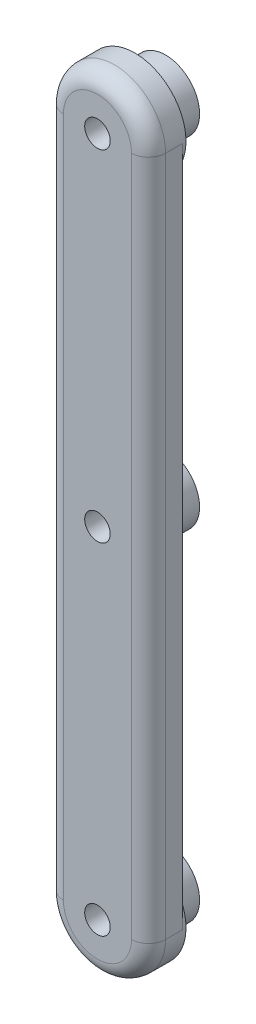
ISO-10303-21;
HEADER;
FILE_DESCRIPTION(('STEP AP214'),'2;1');
FILE_NAME('part.step','',(''),(''),'','','');
FILE_SCHEMA(('AUTOMOTIVE_DESIGN { 1 0 10303 214 1 1 1 1 }'));
ENDSEC;
DATA;
#1=APPLICATION_CONTEXT('core data for automotive mechanical design processes');
#2=APPLICATION_PROTOCOL_DEFINITION('international standard','automotive_design',2000,#1);
#3=PRODUCT_CONTEXT('',#1,'mechanical');
#4=PRODUCT('Part','Part','',(#3));
#5=PRODUCT_RELATED_PRODUCT_CATEGORY('part','',(#4));
#6=PRODUCT_DEFINITION_FORMATION('','',#4);
#7=PRODUCT_DEFINITION_CONTEXT('part definition',#1,'design');
#8=PRODUCT_DEFINITION('design','',#6,#7);
#9=PRODUCT_DEFINITION_SHAPE('','',#8);
#10=(LENGTH_UNIT() NAMED_UNIT(*) SI_UNIT(.MILLI.,.METRE.));
#11=(NAMED_UNIT(*) PLANE_ANGLE_UNIT() SI_UNIT($,.RADIAN.));
#12=(NAMED_UNIT(*) SI_UNIT($,.STERADIAN.) SOLID_ANGLE_UNIT());
#13=UNCERTAINTY_MEASURE_WITH_UNIT(LENGTH_MEASURE(1.E-05),#10,'distance_accuracy_value','');
#14=(GEOMETRIC_REPRESENTATION_CONTEXT(3) GLOBAL_UNCERTAINTY_ASSIGNED_CONTEXT((#13)) GLOBAL_UNIT_ASSIGNED_CONTEXT((#10,
#11,#12)) REPRESENTATION_CONTEXT('',''));
#15=CARTESIAN_POINT('',(0.,0.,0.));
#16=DIRECTION('',(0.,0.,1.));
#17=DIRECTION('',(1.,0.,0.));
#18=AXIS2_PLACEMENT_3D('',#15,#16,#17);
#19=CARTESIAN_POINT('',(0.,40.,2.));
#20=DIRECTION('',(0.,0.,-1.));
#21=DIRECTION('',(-1.,0.,0.));
#22=AXIS2_PLACEMENT_3D('',#19,#20,#21);
#23=CYLINDRICAL_SURFACE('',#22,6.00000000000001);
#24=DIRECTION('',(0.,0.,-1.));
#25=VECTOR('',#24,1.);
#26=CARTESIAN_POINT('',(-6.00000000000001,40.,2.));
#27=LINE('',#26,#25);
#28=CARTESIAN_POINT('',(-6.00000000000001,40.,0.));
#29=VERTEX_POINT('',#28);
#30=CARTESIAN_POINT('',(-6.00000000000001,40.,-2.));
#31=VERTEX_POINT('',#30);
#32=EDGE_CURVE('E128',#29,#31,#27,.T.);
#33=ORIENTED_EDGE('',*,*,#32,.F.);
#34=CARTESIAN_POINT('',(0.,40.,0.));
#35=DIRECTION('',(0.,0.,1.));
#36=DIRECTION('',(1.,0.,0.));
#37=AXIS2_PLACEMENT_3D('',#34,#35,#36);
#38=CIRCLE('',#37,6.00000000000001);
#39=CARTESIAN_POINT('',(6.00000000000002,40.,0.));
#40=VERTEX_POINT('',#39);
#41=EDGE_CURVE('E11',#29,#40,#38,.F.);
#42=ORIENTED_EDGE('',*,*,#41,.T.);
#43=DIRECTION('',(0.,0.,-1.));
#44=VECTOR('',#43,1.);
#45=CARTESIAN_POINT('',(6.00000000000002,40.,2.));
#46=LINE('',#45,#44);
#47=CARTESIAN_POINT('',(6.00000000000003,40.,-2.));
#48=VERTEX_POINT('',#47);
#49=EDGE_CURVE('E95',#40,#48,#46,.T.);
#50=ORIENTED_EDGE('',*,*,#49,.T.);
#51=CARTESIAN_POINT('',(0.,40.,-2.));
#52=DIRECTION('',(0.,0.,-1.));
#53=DIRECTION('',(-1.,0.,0.));
#54=AXIS2_PLACEMENT_3D('',#51,#52,#53);
#55=CIRCLE('',#54,6.00000000000001);
#56=EDGE_CURVE('E98',#48,#31,#55,.T.);
#57=ORIENTED_EDGE('',*,*,#56,.T.);
#58=EDGE_LOOP('',(#33,#42,#50,#57));
#59=FACE_BOUND('',#58,.T.);
#60=CARTESIAN_POINT('',(0.,40.,-2.4));
#61=DIRECTION('',(0.,0.,-1.));
#62=DIRECTION('',(-1.,0.,0.));
#63=AXIS2_PLACEMENT_3D('',#60,#61,#62);
#64=CIRCLE('',#63,6.00000000000001);
#65=CARTESIAN_POINT('',(-5.99999999999999,40.,-2.4));
#66=VERTEX_POINT('',#65);
#67=EDGE_CURVE('E180',#66,#66,#64,.T.);
#68=ORIENTED_EDGE('',*,*,#67,.F.);
#69=EDGE_LOOP('',(#68));
#70=FACE_BOUND('',#69,.T.);
#71=ADVANCED_FACE('F41',(#59,#70),#23,.T.);
#72=CARTESIAN_POINT('',(-6.00000000000001,40.,2.));
#73=DIRECTION('',(1.,0.,0.));
#74=DIRECTION('',(0.,1.,0.));
#75=AXIS2_PLACEMENT_3D('',#72,#73,#74);
#76=PLANE('',#75);
#77=DIRECTION('',(0.,0.,-1.));
#78=VECTOR('',#77,1.);
#79=CARTESIAN_POINT('',(-5.99999999999999,-40.,2.));
#80=LINE('',#79,#78);
#81=CARTESIAN_POINT('',(-5.99999999999999,-40.,0.));
#82=VERTEX_POINT('',#81);
#83=CARTESIAN_POINT('',(-5.99999999999999,-40.,-2.));
#84=VERTEX_POINT('',#83);
#85=EDGE_CURVE('E126',#82,#84,#80,.T.);
#86=ORIENTED_EDGE('',*,*,#85,.F.);
#87=DIRECTION('',(0.,-1.,0.));
#88=VECTOR('',#87,1.);
#89=CARTESIAN_POINT('',(-6.00000000000001,40.,0.));
#90=LINE('',#89,#88);
#91=EDGE_CURVE('E50',#82,#29,#90,.F.);
#92=ORIENTED_EDGE('',*,*,#91,.T.);
#93=ORIENTED_EDGE('',*,*,#32,.T.);
#94=DIRECTION('',(0.,-1.,0.));
#95=VECTOR('',#94,1.);
#96=CARTESIAN_POINT('',(-6.00000000000001,40.,-2.));
#97=LINE('',#96,#95);
#98=EDGE_CURVE('E115',#31,#84,#97,.T.);
#99=ORIENTED_EDGE('',*,*,#98,.T.);
#100=EDGE_LOOP('',(#86,#92,#93,#99));
#101=FACE_BOUND('',#100,.T.);
#102=ADVANCED_FACE('F202',(#101),#76,.F.);
#103=CARTESIAN_POINT('',(0.,-40.,2.));
#104=DIRECTION('',(0.,0.,-1.));
#105=DIRECTION('',(-1.,0.,0.));
#106=AXIS2_PLACEMENT_3D('',#103,#104,#105);
#107=CYLINDRICAL_SURFACE('',#106,6.00000000000001);
#108=DIRECTION('',(0.,0.,-1.));
#109=VECTOR('',#108,1.);
#110=CARTESIAN_POINT('',(6.00000000000002,-40.,2.));
#111=LINE('',#110,#109);
#112=CARTESIAN_POINT('',(6.00000000000002,-40.,0.));
#113=VERTEX_POINT('',#112);
#114=CARTESIAN_POINT('',(6.00000000000003,-40.,-2.));
#115=VERTEX_POINT('',#114);
#116=EDGE_CURVE('E105',#113,#115,#111,.T.);
#117=ORIENTED_EDGE('',*,*,#116,.F.);
#118=CARTESIAN_POINT('',(0.,-40.,0.));
#119=DIRECTION('',(0.,0.,1.));
#120=DIRECTION('',(1.,0.,0.));
#121=AXIS2_PLACEMENT_3D('',#118,#119,#120);
#122=CIRCLE('',#121,6.00000000000001);
#123=EDGE_CURVE('E65',#113,#82,#122,.F.);
#124=ORIENTED_EDGE('',*,*,#123,.T.);
#125=ORIENTED_EDGE('',*,*,#85,.T.);
#126=CARTESIAN_POINT('',(0.,-40.,-2.));
#127=DIRECTION('',(0.,0.,-1.));
#128=DIRECTION('',(-1.,0.,0.));
#129=AXIS2_PLACEMENT_3D('',#126,#127,#128);
#130=CIRCLE('',#129,6.00000000000001);
#131=EDGE_CURVE('E156',#84,#115,#130,.T.);
#132=ORIENTED_EDGE('',*,*,#131,.T.);
#133=EDGE_LOOP('',(#117,#124,#125,#132));
#134=FACE_BOUND('',#133,.T.);
#135=CARTESIAN_POINT('',(0.,-40.,-2.4));
#136=DIRECTION('',(0.,0.,-1.));
#137=DIRECTION('',(-1.,0.,0.));
#138=AXIS2_PLACEMENT_3D('',#135,#136,#137);
#139=CIRCLE('',#138,6.00000000000001);
#140=CARTESIAN_POINT('',(-5.99999999999999,-40.,-2.4));
#141=VERTEX_POINT('',#140);
#142=EDGE_CURVE('E117',#141,#141,#139,.T.);
#143=ORIENTED_EDGE('',*,*,#142,.F.);
#144=EDGE_LOOP('',(#143));
#145=FACE_BOUND('',#144,.T.);
#146=ADVANCED_FACE('F207',(#134,#145),#107,.T.);
#147=CARTESIAN_POINT('',(6.00000000000002,40.,2.));
#148=DIRECTION('',(-1.,0.,0.));
#149=DIRECTION('',(0.,-1.,0.));
#150=AXIS2_PLACEMENT_3D('',#147,#148,#149);
#151=PLANE('',#150);
#152=ORIENTED_EDGE('',*,*,#49,.F.);
#153=DIRECTION('',(0.,1.,0.));
#154=VECTOR('',#153,1.);
#155=CARTESIAN_POINT('',(6.00000000000002,-40.,0.));
#156=LINE('',#155,#154);
#157=EDGE_CURVE('E142',#40,#113,#156,.F.);
#158=ORIENTED_EDGE('',*,*,#157,.T.);
#159=ORIENTED_EDGE('',*,*,#116,.T.);
#160=DIRECTION('',(0.,1.,0.));
#161=VECTOR('',#160,1.);
#162=CARTESIAN_POINT('',(6.00000000000002,40.,-2.));
#163=LINE('',#162,#161);
#164=EDGE_CURVE('E106',#115,#48,#163,.T.);
#165=ORIENTED_EDGE('',*,*,#164,.T.);
#166=EDGE_LOOP('',(#152,#158,#159,#165));
#167=FACE_BOUND('',#166,.T.);
#168=ADVANCED_FACE('F119',(#167),#151,.F.);
#169=CARTESIAN_POINT('',(0.,40.,2.));
#170=DIRECTION('',(0.,0.,1.));
#171=DIRECTION('',(1.,0.,0.));
#172=AXIS2_PLACEMENT_3D('',#169,#170,#171);
#173=PLANE('',#172);
#174=CARTESIAN_POINT('',(0.,40.,2.));
#175=DIRECTION('',(0.,0.,1.));
#176=DIRECTION('',(1.,0.,0.));
#177=AXIS2_PLACEMENT_3D('',#174,#175,#176);
#178=CIRCLE('',#177,1.5);
#179=CARTESIAN_POINT('',(1.50000000000004,40.,2.));
#180=VERTEX_POINT('',#179);
#181=EDGE_CURVE('E418',#180,#180,#178,.T.);
#182=ORIENTED_EDGE('',*,*,#181,.F.);
#183=EDGE_LOOP('',(#182));
#184=FACE_BOUND('',#183,.T.);
#185=CARTESIAN_POINT('',(0.,0.,2.));
#186=DIRECTION('',(0.,0.,1.));
#187=DIRECTION('',(1.,0.,0.));
#188=AXIS2_PLACEMENT_3D('',#185,#186,#187);
#189=CIRCLE('',#188,1.5);
#190=CARTESIAN_POINT('',(1.5,0.,2.));
#191=VERTEX_POINT('',#190);
#192=EDGE_CURVE('E149',#191,#191,#189,.T.);
#193=ORIENTED_EDGE('',*,*,#192,.F.);
#194=EDGE_LOOP('',(#193));
#195=FACE_BOUND('',#194,.T.);
#196=CARTESIAN_POINT('',(0.,-40.,2.));
#197=DIRECTION('',(0.,0.,1.));
#198=DIRECTION('',(1.,0.,0.));
#199=AXIS2_PLACEMENT_3D('',#196,#197,#198);
#200=CIRCLE('',#199,1.5);
#201=CARTESIAN_POINT('',(1.5,-40.,2.));
#202=VERTEX_POINT('',#201);
#203=EDGE_CURVE('E421',#202,#202,#200,.T.);
#204=ORIENTED_EDGE('',*,*,#203,.F.);
#205=EDGE_LOOP('',(#204));
#206=FACE_BOUND('',#205,.T.);
#207=CARTESIAN_POINT('',(0.,-40.,2.));
#208=DIRECTION('',(0.,0.,1.));
#209=DIRECTION('',(1.,0.,0.));
#210=AXIS2_PLACEMENT_3D('',#207,#208,#209);
#211=CIRCLE('',#210,4.00000000000001);
#212=CARTESIAN_POINT('',(-4.,-40.,2.));
#213=VERTEX_POINT('',#212);
#214=CARTESIAN_POINT('',(4.00000000000003,-40.,2.));
#215=VERTEX_POINT('',#214);
#216=EDGE_CURVE('E137',#213,#215,#211,.T.);
#217=ORIENTED_EDGE('',*,*,#216,.T.);
#218=DIRECTION('',(0.,1.,0.));
#219=VECTOR('',#218,1.);
#220=CARTESIAN_POINT('',(4.00000000000002,40.,2.));
#221=LINE('',#220,#219);
#222=CARTESIAN_POINT('',(4.00000000000003,40.,2.));
#223=VERTEX_POINT('',#222);
#224=EDGE_CURVE('E139',#215,#223,#221,.T.);
#225=ORIENTED_EDGE('',*,*,#224,.T.);
#226=CARTESIAN_POINT('',(0.,40.,2.));
#227=DIRECTION('',(0.,0.,1.));
#228=DIRECTION('',(1.,0.,0.));
#229=AXIS2_PLACEMENT_3D('',#226,#227,#228);
#230=CIRCLE('',#229,4.00000000000001);
#231=CARTESIAN_POINT('',(-3.99999999999999,40.,2.));
#232=VERTEX_POINT('',#231);
#233=EDGE_CURVE('E133',#223,#232,#230,.T.);
#234=ORIENTED_EDGE('',*,*,#233,.T.);
#235=DIRECTION('',(0.,-1.,0.));
#236=VECTOR('',#235,1.);
#237=CARTESIAN_POINT('',(-4.,-40.,2.));
#238=LINE('',#237,#236);
#239=EDGE_CURVE('E135',#232,#213,#238,.T.);
#240=ORIENTED_EDGE('',*,*,#239,.T.);
#241=EDGE_LOOP('',(#217,#225,#234,#240));
#242=FACE_BOUND('',#241,.T.);
#243=ADVANCED_FACE('F238',(#184,#195,#206,#242),#173,.T.);
#244=CARTESIAN_POINT('',(0.,40.,-2.));
#245=DIRECTION('',(0.,0.,1.));
#246=DIRECTION('',(1.,0.,0.));
#247=AXIS2_PLACEMENT_3D('',#244,#245,#246);
#248=PLANE('',#247);
#249=ORIENTED_EDGE('',*,*,#56,.F.);
#250=ORIENTED_EDGE('',*,*,#164,.F.);
#251=ORIENTED_EDGE('',*,*,#131,.F.);
#252=ORIENTED_EDGE('',*,*,#98,.F.);
#253=EDGE_LOOP('',(#249,#250,#251,#252));
#254=FACE_BOUND('',#253,.T.);
#255=CARTESIAN_POINT('',(0.,0.,-2.));
#256=DIRECTION('',(0.,0.,1.));
#257=DIRECTION('',(1.,0.,0.));
#258=AXIS2_PLACEMENT_3D('',#255,#256,#257);
#259=CIRCLE('',#258,4.);
#260=CARTESIAN_POINT('',(4.,0.,-2.));
#261=VERTEX_POINT('',#260);
#262=EDGE_CURVE('E130',#261,#261,#259,.F.);
#263=ORIENTED_EDGE('',*,*,#262,.F.);
#264=EDGE_LOOP('',(#263));
#265=FACE_BOUND('',#264,.T.);
#266=ADVANCED_FACE('F110',(#254,#265),#248,.F.);
#267=CARTESIAN_POINT('',(0.,0.,-6.));
#268=DIRECTION('',(0.,0.,1.));
#269=DIRECTION('',(1.,0.,0.));
#270=AXIS2_PLACEMENT_3D('',#267,#268,#269);
#271=CYLINDRICAL_SURFACE('',#270,1.5);
#272=CARTESIAN_POINT('',(0.,0.,-6.));
#273=DIRECTION('',(0.,0.,-1.));
#274=DIRECTION('',(-1.,0.,0.));
#275=AXIS2_PLACEMENT_3D('',#272,#273,#274);
#276=CIRCLE('',#275,1.5);
#277=CARTESIAN_POINT('',(-1.5,0.,-6.));
#278=VERTEX_POINT('',#277);
#279=EDGE_CURVE('E172',#278,#278,#276,.T.);
#280=ORIENTED_EDGE('',*,*,#279,.T.);
#281=EDGE_LOOP('',(#280));
#282=FACE_BOUND('',#281,.T.);
#283=ORIENTED_EDGE('',*,*,#192,.T.);
#284=EDGE_LOOP('',(#283));
#285=FACE_BOUND('',#284,.T.);
#286=ADVANCED_FACE('F249',(#282,#285),#271,.F.);
#287=CARTESIAN_POINT('',(0.,0.,-6.));
#288=DIRECTION('',(0.,0.,1.));
#289=DIRECTION('',(1.,0.,0.));
#290=AXIS2_PLACEMENT_3D('',#287,#288,#289);
#291=CYLINDRICAL_SURFACE('',#290,4.);
#292=CARTESIAN_POINT('',(0.,0.,-6.));
#293=DIRECTION('',(0.,0.,-1.));
#294=DIRECTION('',(-1.,0.,0.));
#295=AXIS2_PLACEMENT_3D('',#292,#293,#294);
#296=CIRCLE('',#295,4.);
#297=CARTESIAN_POINT('',(-4.,0.,-6.));
#298=VERTEX_POINT('',#297);
#299=EDGE_CURVE('E169',#298,#298,#296,.T.);
#300=ORIENTED_EDGE('',*,*,#299,.F.);
#301=EDGE_LOOP('',(#300));
#302=FACE_BOUND('',#301,.T.);
#303=ORIENTED_EDGE('',*,*,#262,.T.);
#304=EDGE_LOOP('',(#303));
#305=FACE_BOUND('',#304,.T.);
#306=ADVANCED_FACE('F252',(#302,#305),#291,.T.);
#307=CARTESIAN_POINT('',(0.,0.,-6.));
#308=DIRECTION('',(0.,0.,-1.));
#309=DIRECTION('',(-1.,0.,0.));
#310=AXIS2_PLACEMENT_3D('',#307,#308,#309);
#311=PLANE('',#310);
#312=ORIENTED_EDGE('',*,*,#279,.F.);
#313=EDGE_LOOP('',(#312));
#314=FACE_BOUND('',#313,.T.);
#315=ORIENTED_EDGE('',*,*,#299,.T.);
#316=EDGE_LOOP('',(#315));
#317=FACE_BOUND('',#316,.T.);
#318=ADVANCED_FACE('F304',(#314,#317),#311,.T.);
#319=CARTESIAN_POINT('',(0.,0.,-2.4));
#320=DIRECTION('',(0.,0.,-1.));
#321=DIRECTION('',(-1.,0.,0.));
#322=AXIS2_PLACEMENT_3D('',#319,#320,#321);
#323=PLANE('',#322);
#324=CARTESIAN_POINT('',(0.,40.,-2.4));
#325=DIRECTION('',(0.,0.,-1.));
#326=DIRECTION('',(-1.,0.,0.));
#327=AXIS2_PLACEMENT_3D('',#324,#325,#326);
#328=CIRCLE('',#327,4.);
#329=CARTESIAN_POINT('',(-3.99999999999997,40.,-2.4));
#330=VERTEX_POINT('',#329);
#331=EDGE_CURVE('E116',#330,#330,#328,.T.);
#332=ORIENTED_EDGE('',*,*,#331,.F.);
#333=EDGE_LOOP('',(#332));
#334=FACE_BOUND('',#333,.T.);
#335=ORIENTED_EDGE('',*,*,#67,.T.);
#336=EDGE_LOOP('',(#335));
#337=FACE_BOUND('',#336,.T.);
#338=ADVANCED_FACE('F313',(#334,#337),#323,.T.);
#339=CARTESIAN_POINT('',(0.,0.,-2.4));
#340=DIRECTION('',(0.,0.,-1.));
#341=DIRECTION('',(-1.,0.,0.));
#342=AXIS2_PLACEMENT_3D('',#339,#340,#341);
#343=PLANE('',#342);
#344=CARTESIAN_POINT('',(0.,-40.,-2.4));
#345=DIRECTION('',(0.,0.,-1.));
#346=DIRECTION('',(-1.,0.,0.));
#347=AXIS2_PLACEMENT_3D('',#344,#345,#346);
#348=CIRCLE('',#347,4.);
#349=CARTESIAN_POINT('',(-4.,-40.,-2.4));
#350=VERTEX_POINT('',#349);
#351=EDGE_CURVE('E160',#350,#350,#348,.T.);
#352=ORIENTED_EDGE('',*,*,#351,.F.);
#353=EDGE_LOOP('',(#352));
#354=FACE_BOUND('',#353,.T.);
#355=ORIENTED_EDGE('',*,*,#142,.T.);
#356=EDGE_LOOP('',(#355));
#357=FACE_BOUND('',#356,.T.);
#358=ADVANCED_FACE('F263',(#354,#357),#343,.T.);
#359=CARTESIAN_POINT('',(0.,40.,-6.));
#360=DIRECTION('',(0.,0.,1.));
#361=DIRECTION('',(1.,0.,0.));
#362=AXIS2_PLACEMENT_3D('',#359,#360,#361);
#363=CYLINDRICAL_SURFACE('',#362,1.5);
#364=CARTESIAN_POINT('',(0.,40.,-6.));
#365=DIRECTION('',(0.,0.,-1.));
#366=DIRECTION('',(-1.,0.,0.));
#367=AXIS2_PLACEMENT_3D('',#364,#365,#366);
#368=CIRCLE('',#367,1.5);
#369=CARTESIAN_POINT('',(-1.49999999999996,40.,-6.));
#370=VERTEX_POINT('',#369);
#371=EDGE_CURVE('E166',#370,#370,#368,.T.);
#372=ORIENTED_EDGE('',*,*,#371,.T.);
#373=EDGE_LOOP('',(#372));
#374=FACE_BOUND('',#373,.T.);
#375=ORIENTED_EDGE('',*,*,#181,.T.);
#376=EDGE_LOOP('',(#375));
#377=FACE_BOUND('',#376,.T.);
#378=ADVANCED_FACE('F259',(#374,#377),#363,.F.);
#379=CARTESIAN_POINT('',(0.,0.,-6.));
#380=DIRECTION('',(0.,0.,-1.));
#381=DIRECTION('',(-1.,0.,0.));
#382=AXIS2_PLACEMENT_3D('',#379,#380,#381);
#383=PLANE('',#382);
#384=ORIENTED_EDGE('',*,*,#371,.F.);
#385=EDGE_LOOP('',(#384));
#386=FACE_BOUND('',#385,.T.);
#387=CARTESIAN_POINT('',(0.,40.,-6.));
#388=DIRECTION('',(0.,0.,-1.));
#389=DIRECTION('',(-1.,0.,0.));
#390=AXIS2_PLACEMENT_3D('',#387,#388,#389);
#391=CIRCLE('',#390,4.);
#392=CARTESIAN_POINT('',(-3.99999999999997,40.,-6.));
#393=VERTEX_POINT('',#392);
#394=EDGE_CURVE('E121',#393,#393,#391,.T.);
#395=ORIENTED_EDGE('',*,*,#394,.T.);
#396=EDGE_LOOP('',(#395));
#397=FACE_BOUND('',#396,.T.);
#398=ADVANCED_FACE('F262',(#386,#397),#383,.T.);
#399=CARTESIAN_POINT('',(0.,40.,-6.));
#400=DIRECTION('',(0.,0.,1.));
#401=DIRECTION('',(1.,0.,0.));
#402=AXIS2_PLACEMENT_3D('',#399,#400,#401);
#403=CYLINDRICAL_SURFACE('',#402,4.);
#404=ORIENTED_EDGE('',*,*,#331,.T.);
#405=EDGE_LOOP('',(#404));
#406=FACE_BOUND('',#405,.T.);
#407=ORIENTED_EDGE('',*,*,#394,.F.);
#408=EDGE_LOOP('',(#407));
#409=FACE_BOUND('',#408,.T.);
#410=ADVANCED_FACE('F271',(#406,#409),#403,.T.);
#411=CARTESIAN_POINT('',(0.,-40.,-6.));
#412=DIRECTION('',(0.,0.,1.));
#413=DIRECTION('',(1.,0.,0.));
#414=AXIS2_PLACEMENT_3D('',#411,#412,#413);
#415=CYLINDRICAL_SURFACE('',#414,1.5);
#416=CARTESIAN_POINT('',(0.,-40.,-6.));
#417=DIRECTION('',(0.,0.,-1.));
#418=DIRECTION('',(-1.,0.,0.));
#419=AXIS2_PLACEMENT_3D('',#416,#417,#418);
#420=CIRCLE('',#419,1.5);
#421=CARTESIAN_POINT('',(-1.5,-40.,-6.));
#422=VERTEX_POINT('',#421);
#423=EDGE_CURVE('E178',#422,#422,#420,.T.);
#424=ORIENTED_EDGE('',*,*,#423,.T.);
#425=EDGE_LOOP('',(#424));
#426=FACE_BOUND('',#425,.T.);
#427=ORIENTED_EDGE('',*,*,#203,.T.);
#428=EDGE_LOOP('',(#427));
#429=FACE_BOUND('',#428,.T.);
#430=ADVANCED_FACE('F198',(#426,#429),#415,.F.);
#431=CARTESIAN_POINT('',(0.,0.,-6.));
#432=DIRECTION('',(0.,0.,-1.));
#433=DIRECTION('',(-1.,0.,0.));
#434=AXIS2_PLACEMENT_3D('',#431,#432,#433);
#435=PLANE('',#434);
#436=ORIENTED_EDGE('',*,*,#423,.F.);
#437=EDGE_LOOP('',(#436));
#438=FACE_BOUND('',#437,.T.);
#439=CARTESIAN_POINT('',(0.,-40.,-6.));
#440=DIRECTION('',(0.,0.,-1.));
#441=DIRECTION('',(-1.,0.,0.));
#442=AXIS2_PLACEMENT_3D('',#439,#440,#441);
#443=CIRCLE('',#442,4.);
#444=CARTESIAN_POINT('',(-4.,-40.,-6.));
#445=VERTEX_POINT('',#444);
#446=EDGE_CURVE('E175',#445,#445,#443,.T.);
#447=ORIENTED_EDGE('',*,*,#446,.T.);
#448=EDGE_LOOP('',(#447));
#449=FACE_BOUND('',#448,.T.);
#450=ADVANCED_FACE('F184',(#438,#449),#435,.T.);
#451=CARTESIAN_POINT('',(0.,-40.,-6.));
#452=DIRECTION('',(0.,0.,1.));
#453=DIRECTION('',(1.,0.,0.));
#454=AXIS2_PLACEMENT_3D('',#451,#452,#453);
#455=CYLINDRICAL_SURFACE('',#454,4.);
#456=ORIENTED_EDGE('',*,*,#351,.T.);
#457=EDGE_LOOP('',(#456));
#458=FACE_BOUND('',#457,.T.);
#459=ORIENTED_EDGE('',*,*,#446,.F.);
#460=EDGE_LOOP('',(#459));
#461=FACE_BOUND('',#460,.T.);
#462=ADVANCED_FACE('F186',(#458,#461),#455,.T.);
#463=CARTESIAN_POINT('',(-4.00000000000001,40.,0.));
#464=DIRECTION('',(0.,1.,0.));
#465=DIRECTION('',(-1.,0.,0.));
#466=AXIS2_PLACEMENT_3D('',#463,#464,#465);
#467=CYLINDRICAL_SURFACE('',#466,2.);
#468=CARTESIAN_POINT('',(-4.00000000000001,40.,0.));
#469=DIRECTION('',(0.,1.,0.));
#470=DIRECTION('',(0.,0.,1.));
#471=AXIS2_PLACEMENT_3D('',#468,#469,#470);
#472=CIRCLE('',#471,2.);
#473=EDGE_CURVE('E150',#29,#232,#472,.T.);
#474=ORIENTED_EDGE('',*,*,#473,.F.);
#475=ORIENTED_EDGE('',*,*,#91,.F.);
#476=CARTESIAN_POINT('',(-4.,-40.,0.));
#477=DIRECTION('',(0.,-1.,0.));
#478=DIRECTION('',(0.,0.,-1.));
#479=AXIS2_PLACEMENT_3D('',#476,#477,#478);
#480=CIRCLE('',#479,2.);
#481=EDGE_CURVE('E45',#213,#82,#480,.T.);
#482=ORIENTED_EDGE('',*,*,#481,.F.);
#483=ORIENTED_EDGE('',*,*,#239,.F.);
#484=EDGE_LOOP('',(#474,#475,#482,#483));
#485=FACE_BOUND('',#484,.T.);
#486=ADVANCED_FACE('F43',(#485),#467,.T.);
#487=CARTESIAN_POINT('',(0.,-40.,0.));
#488=DIRECTION('',(0.,0.,1.));
#489=DIRECTION('',(1.,0.,0.));
#490=AXIS2_PLACEMENT_3D('',#487,#488,#489);
#491=TOROIDAL_SURFACE('',#490,4.00000000000001,2.);
#492=ORIENTED_EDGE('',*,*,#481,.T.);
#493=ORIENTED_EDGE('',*,*,#123,.F.);
#494=CARTESIAN_POINT('',(4.00000000000003,-40.,0.));
#495=DIRECTION('',(0.,1.,0.));
#496=DIRECTION('',(0.,0.,1.));
#497=AXIS2_PLACEMENT_3D('',#494,#495,#496);
#498=CIRCLE('',#497,2.);
#499=EDGE_CURVE('E148',#215,#113,#498,.T.);
#500=ORIENTED_EDGE('',*,*,#499,.F.);
#501=ORIENTED_EDGE('',*,*,#216,.F.);
#502=EDGE_LOOP('',(#492,#493,#500,#501));
#503=FACE_BOUND('',#502,.T.);
#504=ADVANCED_FACE('F195',(#503),#491,.T.);
#505=CARTESIAN_POINT('',(0.,40.,0.));
#506=DIRECTION('',(0.,0.,1.));
#507=DIRECTION('',(1.,0.,0.));
#508=AXIS2_PLACEMENT_3D('',#505,#506,#507);
#509=TOROIDAL_SURFACE('',#508,4.00000000000001,2.);
#510=ORIENTED_EDGE('',*,*,#473,.T.);
#511=ORIENTED_EDGE('',*,*,#233,.F.);
#512=CARTESIAN_POINT('',(4.00000000000003,40.,0.));
#513=DIRECTION('',(0.,-1.,0.));
#514=DIRECTION('',(0.,0.,-1.));
#515=AXIS2_PLACEMENT_3D('',#512,#513,#514);
#516=CIRCLE('',#515,2.);
#517=EDGE_CURVE('E146',#40,#223,#516,.T.);
#518=ORIENTED_EDGE('',*,*,#517,.F.);
#519=ORIENTED_EDGE('',*,*,#41,.F.);
#520=EDGE_LOOP('',(#510,#511,#518,#519));
#521=FACE_BOUND('',#520,.T.);
#522=ADVANCED_FACE('F214',(#521),#509,.T.);
#523=CARTESIAN_POINT('',(4.00000000000002,40.,0.));
#524=DIRECTION('',(0.,-1.,0.));
#525=DIRECTION('',(1.,0.,0.));
#526=AXIS2_PLACEMENT_3D('',#523,#524,#525);
#527=CYLINDRICAL_SURFACE('',#526,2.);
#528=ORIENTED_EDGE('',*,*,#499,.T.);
#529=ORIENTED_EDGE('',*,*,#157,.F.);
#530=ORIENTED_EDGE('',*,*,#517,.T.);
#531=ORIENTED_EDGE('',*,*,#224,.F.);
#532=EDGE_LOOP('',(#528,#529,#530,#531));
#533=FACE_BOUND('',#532,.T.);
#534=ADVANCED_FACE('F211',(#533),#527,.T.);
#535=CLOSED_SHELL('',(#71,#102,#146,#168,#243,#266,#286,#306,#318,#338,#358,#378,#398,#410,#430,
#450,#462,#486,#504,#522,#534));
#536=MANIFOLD_SOLID_BREP('B2',#535);
#537=ADVANCED_BREP_SHAPE_REPRESENTATION('',(#18,#536),#14);
#538=SHAPE_DEFINITION_REPRESENTATION(#9,#537);
ENDSEC;
END-ISO-10303-21;
